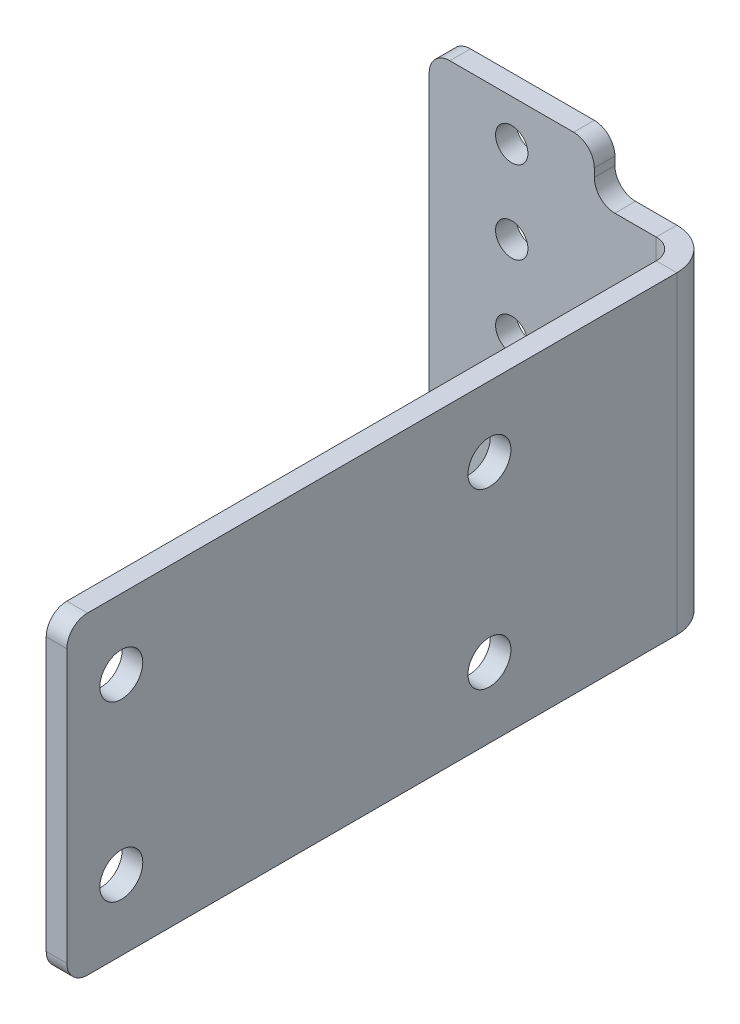
ISO-10303-21;
HEADER;
FILE_DESCRIPTION(('STEP AP214'),'2;1');
FILE_NAME('part.step','',(''),(''),'','','');
FILE_SCHEMA(('AUTOMOTIVE_DESIGN { 1 0 10303 214 1 1 1 1 }'));
ENDSEC;
DATA;
#1=APPLICATION_CONTEXT('core data for automotive mechanical design processes');
#2=APPLICATION_PROTOCOL_DEFINITION('international standard','automotive_design',2000,#1);
#3=PRODUCT_CONTEXT('',#1,'mechanical');
#4=PRODUCT('Part','Part','',(#3));
#5=PRODUCT_RELATED_PRODUCT_CATEGORY('part','',(#4));
#6=PRODUCT_DEFINITION_FORMATION('','',#4);
#7=PRODUCT_DEFINITION_CONTEXT('part definition',#1,'design');
#8=PRODUCT_DEFINITION('design','',#6,#7);
#9=PRODUCT_DEFINITION_SHAPE('','',#8);
#10=(LENGTH_UNIT() NAMED_UNIT(*) SI_UNIT(.MILLI.,.METRE.));
#11=(NAMED_UNIT(*) PLANE_ANGLE_UNIT() SI_UNIT($,.RADIAN.));
#12=(NAMED_UNIT(*) SI_UNIT($,.STERADIAN.) SOLID_ANGLE_UNIT());
#13=UNCERTAINTY_MEASURE_WITH_UNIT(LENGTH_MEASURE(1.E-05),#10,'distance_accuracy_value','');
#14=(GEOMETRIC_REPRESENTATION_CONTEXT(3) GLOBAL_UNCERTAINTY_ASSIGNED_CONTEXT((#13)) GLOBAL_UNIT_ASSIGNED_CONTEXT((#10,
#11,#12)) REPRESENTATION_CONTEXT('',''));
#15=CARTESIAN_POINT('',(0.,0.,0.));
#16=DIRECTION('',(0.,0.,1.));
#17=DIRECTION('',(1.,0.,0.));
#18=AXIS2_PLACEMENT_3D('',#15,#16,#17);
#19=CARTESIAN_POINT('',(-301.625,-138.43,170.7515));
#20=DIRECTION('',(0.,-1.,0.));
#21=DIRECTION('',(0.,0.,-1.));
#22=AXIS2_PLACEMENT_3D('',#19,#20,#21);
#23=PLANE('',#22);
#24=DIRECTION('',(1.,0.,0.));
#25=VECTOR('',#24,1.);
#26=CARTESIAN_POINT('',(-301.625,-138.43,217.678));
#27=LINE('',#26,#25);
#28=CARTESIAN_POINT('',(-304.8,-138.43,217.678));
#29=VERTEX_POINT('',#28);
#30=CARTESIAN_POINT('',(-301.625,-138.43,217.678));
#31=VERTEX_POINT('',#30);
#32=EDGE_CURVE('E11',#29,#31,#27,.T.);
#33=ORIENTED_EDGE('',*,*,#32,.F.);
#34=DIRECTION('',(0.,0.,1.));
#35=VECTOR('',#34,1.);
#36=CARTESIAN_POINT('',(-304.8,-138.43,170.75275));
#37=LINE('',#36,#35);
#38=CARTESIAN_POINT('',(-304.8,-138.43,127.));
#39=VERTEX_POINT('',#38);
#40=EDGE_CURVE('E212',#29,#39,#37,.F.);
#41=ORIENTED_EDGE('',*,*,#40,.T.);
#42=DIRECTION('',(1.,0.,0.));
#43=VECTOR('',#42,1.);
#44=CARTESIAN_POINT('',(-301.625,-138.43,127.));
#45=LINE('',#44,#43);
#46=CARTESIAN_POINT('',(-301.625,-138.43,127.));
#47=VERTEX_POINT('',#46);
#48=EDGE_CURVE('E28',#39,#47,#45,.T.);
#49=ORIENTED_EDGE('',*,*,#48,.T.);
#50=DIRECTION('',(0.,0.,-1.));
#51=VECTOR('',#50,1.);
#52=CARTESIAN_POINT('',(-301.625,-138.43,170.7515));
#53=LINE('',#52,#51);
#54=EDGE_CURVE('E164',#31,#47,#53,.T.);
#55=ORIENTED_EDGE('',*,*,#54,.F.);
#56=EDGE_LOOP('',(#33,#41,#49,#55));
#57=FACE_BOUND('',#56,.T.);
#58=ADVANCED_FACE('F17',(#57),#23,.T.);
#59=CARTESIAN_POINT('',(-301.625,-90.17,170.7515));
#60=DIRECTION('',(0.,-1.,0.));
#61=DIRECTION('',(0.,0.,-1.));
#62=AXIS2_PLACEMENT_3D('',#59,#60,#61);
#63=PLANE('',#62);
#64=DIRECTION('',(1.,0.,0.));
#65=VECTOR('',#64,1.);
#66=CARTESIAN_POINT('',(-301.625,-90.17,127.));
#67=LINE('',#66,#65);
#68=CARTESIAN_POINT('',(-304.8,-90.17,127.));
#69=VERTEX_POINT('',#68);
#70=CARTESIAN_POINT('',(-301.625,-90.17,127.));
#71=VERTEX_POINT('',#70);
#72=EDGE_CURVE('E144',#69,#71,#67,.T.);
#73=ORIENTED_EDGE('',*,*,#72,.F.);
#74=DIRECTION('',(0.,0.,1.));
#75=VECTOR('',#74,1.);
#76=CARTESIAN_POINT('',(-304.8,-90.17,170.75275));
#77=LINE('',#76,#75);
#78=CARTESIAN_POINT('',(-304.8,-90.17,217.678));
#79=VERTEX_POINT('',#78);
#80=EDGE_CURVE('E205',#79,#69,#77,.F.);
#81=ORIENTED_EDGE('',*,*,#80,.F.);
#82=DIRECTION('',(1.,0.,0.));
#83=VECTOR('',#82,1.);
#84=CARTESIAN_POINT('',(-301.625,-90.17,217.678));
#85=LINE('',#84,#83);
#86=CARTESIAN_POINT('',(-301.625,-90.17,217.678));
#87=VERTEX_POINT('',#86);
#88=EDGE_CURVE('E154',#79,#87,#85,.T.);
#89=ORIENTED_EDGE('',*,*,#88,.T.);
#90=DIRECTION('',(0.,0.,-1.));
#91=VECTOR('',#90,1.);
#92=CARTESIAN_POINT('',(-301.625,-90.17,170.7515));
#93=LINE('',#92,#91);
#94=EDGE_CURVE('E162',#87,#71,#93,.T.);
#95=ORIENTED_EDGE('',*,*,#94,.T.);
#96=EDGE_LOOP('',(#73,#81,#89,#95));
#97=FACE_BOUND('',#96,.T.);
#98=ADVANCED_FACE('F167',(#97),#63,.F.);
#99=CARTESIAN_POINT('',(-301.625,-93.345,217.678));
#100=DIRECTION('',(1.,0.,0.));
#101=DIRECTION('',(0.,0.,-1.));
#102=AXIS2_PLACEMENT_3D('',#99,#100,#101);
#103=CYLINDRICAL_SURFACE('',#102,3.175);
#104=ORIENTED_EDGE('',*,*,#88,.F.);
#105=CARTESIAN_POINT('',(-304.8,-93.345,217.678));
#106=DIRECTION('',(1.,0.,0.));
#107=DIRECTION('',(0.,0.,-1.));
#108=AXIS2_PLACEMENT_3D('',#105,#106,#107);
#109=CIRCLE('',#108,3.175);
#110=CARTESIAN_POINT('',(-304.8,-93.345,220.853));
#111=VERTEX_POINT('',#110);
#112=EDGE_CURVE('E202',#79,#111,#109,.T.);
#113=ORIENTED_EDGE('',*,*,#112,.T.);
#114=DIRECTION('',(1.,0.,0.));
#115=VECTOR('',#114,1.);
#116=CARTESIAN_POINT('',(-301.625,-93.345,220.853));
#117=LINE('',#116,#115);
#118=CARTESIAN_POINT('',(-301.625,-93.345,220.853));
#119=VERTEX_POINT('',#118);
#120=EDGE_CURVE('E36',#111,#119,#117,.T.);
#121=ORIENTED_EDGE('',*,*,#120,.T.);
#122=CARTESIAN_POINT('',(-301.625,-93.345,217.678));
#123=DIRECTION('',(1.,0.,0.));
#124=DIRECTION('',(0.,-1.,0.));
#125=AXIS2_PLACEMENT_3D('',#122,#123,#124);
#126=CIRCLE('',#125,3.175);
#127=EDGE_CURVE('E169',#87,#119,#126,.T.);
#128=ORIENTED_EDGE('',*,*,#127,.F.);
#129=EDGE_LOOP('',(#104,#113,#121,#128));
#130=FACE_BOUND('',#129,.T.);
#131=ADVANCED_FACE('F549',(#130),#103,.T.);
#132=CARTESIAN_POINT('',(-301.625,-114.3,220.853));
#133=DIRECTION('',(0.,0.,1.));
#134=DIRECTION('',(0.,-1.,0.));
#135=AXIS2_PLACEMENT_3D('',#132,#133,#134);
#136=PLANE('',#135);
#137=ORIENTED_EDGE('',*,*,#120,.F.);
#138=DIRECTION('',(0.,1.,0.));
#139=VECTOR('',#138,1.);
#140=CARTESIAN_POINT('',(-304.8,-114.3,220.853));
#141=LINE('',#140,#139);
#142=CARTESIAN_POINT('',(-304.8,-135.255,220.853));
#143=VERTEX_POINT('',#142);
#144=EDGE_CURVE('E197',#111,#143,#141,.F.);
#145=ORIENTED_EDGE('',*,*,#144,.T.);
#146=DIRECTION('',(1.,0.,0.));
#147=VECTOR('',#146,1.);
#148=CARTESIAN_POINT('',(-301.625,-135.255,220.853));
#149=LINE('',#148,#147);
#150=CARTESIAN_POINT('',(-301.625,-135.255,220.853));
#151=VERTEX_POINT('',#150);
#152=EDGE_CURVE('E21',#143,#151,#149,.T.);
#153=ORIENTED_EDGE('',*,*,#152,.T.);
#154=DIRECTION('',(0.,-1.,0.));
#155=VECTOR('',#154,1.);
#156=CARTESIAN_POINT('',(-301.625,-114.3,220.853));
#157=LINE('',#156,#155);
#158=EDGE_CURVE('E451',#119,#151,#157,.T.);
#159=ORIENTED_EDGE('',*,*,#158,.F.);
#160=EDGE_LOOP('',(#137,#145,#153,#159));
#161=FACE_BOUND('',#160,.T.);
#162=ADVANCED_FACE('F554',(#161),#136,.T.);
#163=CARTESIAN_POINT('',(-301.625,-100.965,155.829));
#164=DIRECTION('',(1.,0.,0.));
#165=DIRECTION('',(0.,0.,-1.));
#166=AXIS2_PLACEMENT_3D('',#163,#164,#165);
#167=CYLINDRICAL_SURFACE('',#166,3.302);
#168=CARTESIAN_POINT('',(-301.625,-100.965,155.829));
#169=DIRECTION('',(1.,0.,0.));
#170=DIRECTION('',(0.,0.,-1.));
#171=AXIS2_PLACEMENT_3D('',#168,#169,#170);
#172=CIRCLE('',#171,3.302);
#173=CARTESIAN_POINT('',(-301.625,-100.965,152.527));
#174=VERTEX_POINT('',#173);
#175=EDGE_CURVE('E204',#174,#174,#172,.T.);
#176=ORIENTED_EDGE('',*,*,#175,.T.);
#177=EDGE_LOOP('',(#176));
#178=FACE_BOUND('',#177,.T.);
#179=CARTESIAN_POINT('',(-304.8,-100.965,155.829));
#180=DIRECTION('',(1.,0.,0.));
#181=DIRECTION('',(0.,0.,-1.));
#182=AXIS2_PLACEMENT_3D('',#179,#180,#181);
#183=CIRCLE('',#182,3.302);
#184=CARTESIAN_POINT('',(-304.8,-100.965,152.527));
#185=VERTEX_POINT('',#184);
#186=EDGE_CURVE('E180',#185,#185,#183,.T.);
#187=ORIENTED_EDGE('',*,*,#186,.F.);
#188=EDGE_LOOP('',(#187));
#189=FACE_BOUND('',#188,.T.);
#190=ADVANCED_FACE('F557',(#178,#189),#167,.F.);
#191=CARTESIAN_POINT('',(-301.625,-127.635,212.471));
#192=DIRECTION('',(1.,0.,0.));
#193=DIRECTION('',(0.,0.,-1.));
#194=AXIS2_PLACEMENT_3D('',#191,#192,#193);
#195=CYLINDRICAL_SURFACE('',#194,3.302);
#196=CARTESIAN_POINT('',(-301.625,-127.635,212.471));
#197=DIRECTION('',(1.,0.,0.));
#198=DIRECTION('',(0.,0.,-1.));
#199=AXIS2_PLACEMENT_3D('',#196,#197,#198);
#200=CIRCLE('',#199,3.302);
#201=CARTESIAN_POINT('',(-301.625,-127.635,209.169));
#202=VERTEX_POINT('',#201);
#203=EDGE_CURVE('E439',#202,#202,#200,.T.);
#204=ORIENTED_EDGE('',*,*,#203,.T.);
#205=EDGE_LOOP('',(#204));
#206=FACE_BOUND('',#205,.T.);
#207=CARTESIAN_POINT('',(-304.8,-127.635,212.471));
#208=DIRECTION('',(1.,0.,0.));
#209=DIRECTION('',(0.,0.,-1.));
#210=AXIS2_PLACEMENT_3D('',#207,#208,#209);
#211=CIRCLE('',#210,3.302);
#212=CARTESIAN_POINT('',(-304.8,-127.635,209.169));
#213=VERTEX_POINT('',#212);
#214=EDGE_CURVE('E184',#213,#213,#211,.T.);
#215=ORIENTED_EDGE('',*,*,#214,.F.);
#216=EDGE_LOOP('',(#215));
#217=FACE_BOUND('',#216,.T.);
#218=ADVANCED_FACE('F566',(#206,#217),#195,.F.);
#219=CARTESIAN_POINT('',(-301.625,-127.635,155.829));
#220=DIRECTION('',(1.,0.,0.));
#221=DIRECTION('',(0.,0.,-1.));
#222=AXIS2_PLACEMENT_3D('',#219,#220,#221);
#223=CYLINDRICAL_SURFACE('',#222,3.302);
#224=CARTESIAN_POINT('',(-301.625,-127.635,155.829));
#225=DIRECTION('',(1.,0.,0.));
#226=DIRECTION('',(0.,0.,-1.));
#227=AXIS2_PLACEMENT_3D('',#224,#225,#226);
#228=CIRCLE('',#227,3.302);
#229=CARTESIAN_POINT('',(-301.625,-127.635,152.527));
#230=VERTEX_POINT('',#229);
#231=EDGE_CURVE('E443',#230,#230,#228,.T.);
#232=ORIENTED_EDGE('',*,*,#231,.T.);
#233=EDGE_LOOP('',(#232));
#234=FACE_BOUND('',#233,.T.);
#235=CARTESIAN_POINT('',(-304.8,-127.635,155.829));
#236=DIRECTION('',(1.,0.,0.));
#237=DIRECTION('',(0.,0.,-1.));
#238=AXIS2_PLACEMENT_3D('',#235,#236,#237);
#239=CIRCLE('',#238,3.302);
#240=CARTESIAN_POINT('',(-304.8,-127.635,152.527));
#241=VERTEX_POINT('',#240);
#242=EDGE_CURVE('E189',#241,#241,#239,.T.);
#243=ORIENTED_EDGE('',*,*,#242,.F.);
#244=EDGE_LOOP('',(#243));
#245=FACE_BOUND('',#244,.T.);
#246=ADVANCED_FACE('F562',(#234,#245),#223,.F.);
#247=CARTESIAN_POINT('',(-301.625,-100.965,212.471));
#248=DIRECTION('',(1.,0.,0.));
#249=DIRECTION('',(0.,0.,-1.));
#250=AXIS2_PLACEMENT_3D('',#247,#248,#249);
#251=CYLINDRICAL_SURFACE('',#250,3.302);
#252=CARTESIAN_POINT('',(-301.625,-100.965,212.471));
#253=DIRECTION('',(1.,0.,0.));
#254=DIRECTION('',(0.,0.,-1.));
#255=AXIS2_PLACEMENT_3D('',#252,#253,#254);
#256=CIRCLE('',#255,3.302);
#257=CARTESIAN_POINT('',(-301.625,-100.965,209.169));
#258=VERTEX_POINT('',#257);
#259=EDGE_CURVE('E447',#258,#258,#256,.T.);
#260=ORIENTED_EDGE('',*,*,#259,.T.);
#261=EDGE_LOOP('',(#260));
#262=FACE_BOUND('',#261,.T.);
#263=CARTESIAN_POINT('',(-304.8,-100.965,212.471));
#264=DIRECTION('',(1.,0.,0.));
#265=DIRECTION('',(0.,0.,-1.));
#266=AXIS2_PLACEMENT_3D('',#263,#264,#265);
#267=CIRCLE('',#266,3.302);
#268=CARTESIAN_POINT('',(-304.8,-100.965,209.169));
#269=VERTEX_POINT('',#268);
#270=EDGE_CURVE('E193',#269,#269,#267,.T.);
#271=ORIENTED_EDGE('',*,*,#270,.F.);
#272=EDGE_LOOP('',(#271));
#273=FACE_BOUND('',#272,.T.);
#274=ADVANCED_FACE('F559',(#262,#273),#251,.F.);
#275=CARTESIAN_POINT('',(-301.625,-135.255,217.678));
#276=DIRECTION('',(1.,0.,0.));
#277=DIRECTION('',(0.,0.,-1.));
#278=AXIS2_PLACEMENT_3D('',#275,#276,#277);
#279=CYLINDRICAL_SURFACE('',#278,3.175);
#280=CARTESIAN_POINT('',(-304.8,-135.255,217.678));
#281=DIRECTION('',(1.,0.,0.));
#282=DIRECTION('',(0.,0.,-1.));
#283=AXIS2_PLACEMENT_3D('',#280,#281,#282);
#284=CIRCLE('',#283,3.175);
#285=EDGE_CURVE('E201',#143,#29,#284,.T.);
#286=ORIENTED_EDGE('',*,*,#285,.T.);
#287=ORIENTED_EDGE('',*,*,#32,.T.);
#288=CARTESIAN_POINT('',(-301.625,-135.255,217.678));
#289=DIRECTION('',(1.,0.,0.));
#290=DIRECTION('',(0.,-1.,0.));
#291=AXIS2_PLACEMENT_3D('',#288,#289,#290);
#292=CIRCLE('',#291,3.175);
#293=EDGE_CURVE('E454',#151,#31,#292,.T.);
#294=ORIENTED_EDGE('',*,*,#293,.F.);
#295=ORIENTED_EDGE('',*,*,#152,.F.);
#296=EDGE_LOOP('',(#286,#287,#294,#295));
#297=FACE_BOUND('',#296,.T.);
#298=ADVANCED_FACE('F19',(#297),#279,.T.);
#299=CARTESIAN_POINT('',(-301.625,-114.3,170.75275));
#300=DIRECTION('',(1.,0.,0.));
#301=DIRECTION('',(0.,1.,0.));
#302=AXIS2_PLACEMENT_3D('',#299,#300,#301);
#303=PLANE('',#302);
#304=ORIENTED_EDGE('',*,*,#175,.F.);
#305=EDGE_LOOP('',(#304));
#306=FACE_BOUND('',#305,.T.);
#307=ORIENTED_EDGE('',*,*,#203,.F.);
#308=EDGE_LOOP('',(#307));
#309=FACE_BOUND('',#308,.T.);
#310=ORIENTED_EDGE('',*,*,#231,.F.);
#311=EDGE_LOOP('',(#310));
#312=FACE_BOUND('',#311,.T.);
#313=ORIENTED_EDGE('',*,*,#259,.F.);
#314=EDGE_LOOP('',(#313));
#315=FACE_BOUND('',#314,.T.);
#316=ORIENTED_EDGE('',*,*,#158,.T.);
#317=ORIENTED_EDGE('',*,*,#293,.T.);
#318=ORIENTED_EDGE('',*,*,#54,.T.);
#319=DIRECTION('',(0.,1.,0.));
#320=VECTOR('',#319,1.);
#321=CARTESIAN_POINT('',(-301.625,-114.3,127.));
#322=LINE('',#321,#320);
#323=EDGE_CURVE('E131',#47,#71,#322,.T.);
#324=ORIENTED_EDGE('',*,*,#323,.T.);
#325=ORIENTED_EDGE('',*,*,#94,.F.);
#326=ORIENTED_EDGE('',*,*,#127,.T.);
#327=EDGE_LOOP('',(#316,#317,#318,#324,#325,#326));
#328=FACE_BOUND('',#327,.T.);
#329=ADVANCED_FACE('F160',(#306,#309,#312,#315,#328),#303,.T.);
#330=CARTESIAN_POINT('',(-304.8,-114.3,170.75275));
#331=DIRECTION('',(1.,0.,0.));
#332=DIRECTION('',(0.,1.,0.));
#333=AXIS2_PLACEMENT_3D('',#330,#331,#332);
#334=PLANE('',#333);
#335=ORIENTED_EDGE('',*,*,#186,.T.);
#336=EDGE_LOOP('',(#335));
#337=FACE_BOUND('',#336,.T.);
#338=ORIENTED_EDGE('',*,*,#214,.T.);
#339=EDGE_LOOP('',(#338));
#340=FACE_BOUND('',#339,.T.);
#341=ORIENTED_EDGE('',*,*,#242,.T.);
#342=EDGE_LOOP('',(#341));
#343=FACE_BOUND('',#342,.T.);
#344=ORIENTED_EDGE('',*,*,#270,.T.);
#345=EDGE_LOOP('',(#344));
#346=FACE_BOUND('',#345,.T.);
#347=ORIENTED_EDGE('',*,*,#144,.F.);
#348=ORIENTED_EDGE('',*,*,#112,.F.);
#349=ORIENTED_EDGE('',*,*,#80,.T.);
#350=DIRECTION('',(0.,1.,0.));
#351=VECTOR('',#350,1.);
#352=CARTESIAN_POINT('',(-304.8,-114.3,127.));
#353=LINE('',#352,#351);
#354=EDGE_CURVE('E208',#39,#69,#353,.T.);
#355=ORIENTED_EDGE('',*,*,#354,.F.);
#356=ORIENTED_EDGE('',*,*,#40,.F.);
#357=ORIENTED_EDGE('',*,*,#285,.F.);
#358=EDGE_LOOP('',(#347,#348,#349,#355,#356,#357));
#359=FACE_BOUND('',#358,.T.);
#360=ADVANCED_FACE('F246',(#337,#340,#343,#346,#359),#334,.F.);
#361=CARTESIAN_POINT('',(-330.2,-146.05,120.65));
#362=DIRECTION('',(0.,1.,0.));
#363=DIRECTION('',(-1.,0.,0.));
#364=AXIS2_PLACEMENT_3D('',#361,#362,#363);
#365=PLANE('',#364);
#366=DIRECTION('',(0.,0.,-1.));
#367=VECTOR('',#366,1.);
#368=CARTESIAN_POINT('',(-320.675,-146.05,120.65));
#369=LINE('',#368,#367);
#370=CARTESIAN_POINT('',(-320.675,-146.05,123.825));
#371=VERTEX_POINT('',#370);
#372=CARTESIAN_POINT('',(-320.675,-146.05,120.65));
#373=VERTEX_POINT('',#372);
#374=EDGE_CURVE('E185',#371,#373,#369,.T.);
#375=ORIENTED_EDGE('',*,*,#374,.F.);
#376=DIRECTION('',(1.,0.,0.));
#377=VECTOR('',#376,1.);
#378=CARTESIAN_POINT('',(-322.26375,-146.05,123.825));
#379=LINE('',#378,#377);
#380=CARTESIAN_POINT('',(-339.725,-146.05,123.825));
#381=VERTEX_POINT('',#380);
#382=EDGE_CURVE('E390',#371,#381,#379,.F.);
#383=ORIENTED_EDGE('',*,*,#382,.T.);
#384=DIRECTION('',(0.,0.,-1.));
#385=VECTOR('',#384,1.);
#386=CARTESIAN_POINT('',(-339.725,-146.05,120.65));
#387=LINE('',#386,#385);
#388=CARTESIAN_POINT('',(-339.725,-146.05,120.65));
#389=VERTEX_POINT('',#388);
#390=EDGE_CURVE('E429',#381,#389,#387,.T.);
#391=ORIENTED_EDGE('',*,*,#390,.T.);
#392=DIRECTION('',(-1.,0.,0.));
#393=VECTOR('',#392,1.);
#394=CARTESIAN_POINT('',(-330.2,-146.05,120.65));
#395=LINE('',#394,#393);
#396=EDGE_CURVE('E490',#373,#389,#395,.T.);
#397=ORIENTED_EDGE('',*,*,#396,.F.);
#398=EDGE_LOOP('',(#375,#383,#391,#397));
#399=FACE_BOUND('',#398,.T.);
#400=ADVANCED_FACE('F576',(#399),#365,.F.);
#401=CARTESIAN_POINT('',(-339.725,-142.875,120.65));
#402=DIRECTION('',(0.,0.,1.));
#403=DIRECTION('',(1.,0.,0.));
#404=AXIS2_PLACEMENT_3D('',#401,#402,#403);
#405=CYLINDRICAL_SURFACE('',#404,3.175);
#406=ORIENTED_EDGE('',*,*,#390,.F.);
#407=CARTESIAN_POINT('',(-339.725,-142.875,123.825));
#408=DIRECTION('',(0.,0.,1.));
#409=DIRECTION('',(1.,0.,0.));
#410=AXIS2_PLACEMENT_3D('',#407,#408,#409);
#411=CIRCLE('',#410,3.175);
#412=CARTESIAN_POINT('',(-342.9,-142.875,123.825));
#413=VERTEX_POINT('',#412);
#414=EDGE_CURVE('E386',#381,#413,#411,.F.);
#415=ORIENTED_EDGE('',*,*,#414,.T.);
#416=DIRECTION('',(0.,0.,-1.));
#417=VECTOR('',#416,1.);
#418=CARTESIAN_POINT('',(-342.9,-142.875,120.65));
#419=LINE('',#418,#417);
#420=CARTESIAN_POINT('',(-342.9,-142.875,120.65));
#421=VERTEX_POINT('',#420);
#422=EDGE_CURVE('E426',#413,#421,#419,.T.);
#423=ORIENTED_EDGE('',*,*,#422,.T.);
#424=CARTESIAN_POINT('',(-339.725,-142.875,120.65));
#425=DIRECTION('',(0.,0.,1.));
#426=DIRECTION('',(1.,0.,0.));
#427=AXIS2_PLACEMENT_3D('',#424,#425,#426);
#428=CIRCLE('',#427,3.175);
#429=EDGE_CURVE('E493',#389,#421,#428,.F.);
#430=ORIENTED_EDGE('',*,*,#429,.F.);
#431=EDGE_LOOP('',(#406,#415,#423,#430));
#432=FACE_BOUND('',#431,.T.);
#433=ADVANCED_FACE('F588',(#432),#405,.T.);
#434=CARTESIAN_POINT('',(-342.9,0.,120.65));
#435=DIRECTION('',(-1.,0.,0.));
#436=DIRECTION('',(0.,-1.,0.));
#437=AXIS2_PLACEMENT_3D('',#434,#435,#436);
#438=PLANE('',#437);
#439=ORIENTED_EDGE('',*,*,#422,.F.);
#440=DIRECTION('',(0.,1.,0.));
#441=VECTOR('',#440,1.);
#442=CARTESIAN_POINT('',(-342.9,1.11022302462516E-13,123.825));
#443=LINE('',#442,#441);
#444=CARTESIAN_POINT('',(-342.9,-138.43,123.825));
#445=VERTEX_POINT('',#444);
#446=EDGE_CURVE('E382',#445,#413,#443,.F.);
#447=ORIENTED_EDGE('',*,*,#446,.F.);
#448=DIRECTION('',(0.,0.,-1.));
#449=VECTOR('',#448,1.);
#450=CARTESIAN_POINT('',(-342.9,-138.43,120.65));
#451=LINE('',#450,#449);
#452=CARTESIAN_POINT('',(-342.9,-138.43,120.65));
#453=VERTEX_POINT('',#452);
#454=EDGE_CURVE('E423',#445,#453,#451,.T.);
#455=ORIENTED_EDGE('',*,*,#454,.T.);
#456=DIRECTION('',(0.,-1.,0.));
#457=VECTOR('',#456,1.);
#458=CARTESIAN_POINT('',(-342.9,0.,120.65));
#459=LINE('',#458,#457);
#460=EDGE_CURVE('E499',#453,#421,#459,.T.);
#461=ORIENTED_EDGE('',*,*,#460,.T.);
#462=EDGE_LOOP('',(#439,#447,#455,#461));
#463=FACE_BOUND('',#462,.T.);
#464=ADVANCED_FACE('F592',(#463),#438,.T.);
#465=CARTESIAN_POINT('',(-342.9,0.,120.65));
#466=DIRECTION('',(-1.,0.,0.));
#467=DIRECTION('',(0.,-1.,0.));
#468=AXIS2_PLACEMENT_3D('',#465,#466,#467);
#469=PLANE('',#468);
#470=ORIENTED_EDGE('',*,*,#454,.F.);
#471=DIRECTION('',(0.,1.,0.));
#472=VECTOR('',#471,1.);
#473=CARTESIAN_POINT('',(-342.9,1.11022302462516E-13,123.825));
#474=LINE('',#473,#472);
#475=CARTESIAN_POINT('',(-342.9,-90.17,123.825));
#476=VERTEX_POINT('',#475);
#477=EDGE_CURVE('E378',#476,#445,#474,.F.);
#478=ORIENTED_EDGE('',*,*,#477,.F.);
#479=DIRECTION('',(0.,0.,-1.));
#480=VECTOR('',#479,1.);
#481=CARTESIAN_POINT('',(-342.9,-90.17,120.65));
#482=LINE('',#481,#480);
#483=CARTESIAN_POINT('',(-342.9,-90.17,120.65));
#484=VERTEX_POINT('',#483);
#485=EDGE_CURVE('E420',#476,#484,#482,.T.);
#486=ORIENTED_EDGE('',*,*,#485,.T.);
#487=EDGE_CURVE('E503',#484,#453,#459,.T.);
#488=ORIENTED_EDGE('',*,*,#487,.T.);
#489=EDGE_LOOP('',(#470,#478,#486,#488));
#490=FACE_BOUND('',#489,.T.);
#491=ADVANCED_FACE('F596',(#490),#469,.T.);
#492=CARTESIAN_POINT('',(-342.9,0.,120.65));
#493=DIRECTION('',(-1.,0.,0.));
#494=DIRECTION('',(0.,-1.,0.));
#495=AXIS2_PLACEMENT_3D('',#492,#493,#494);
#496=PLANE('',#495);
#497=ORIENTED_EDGE('',*,*,#485,.F.);
#498=DIRECTION('',(0.,1.,0.));
#499=VECTOR('',#498,1.);
#500=CARTESIAN_POINT('',(-342.9,1.11022302462516E-13,123.825));
#501=LINE('',#500,#499);
#502=CARTESIAN_POINT('',(-342.9,-85.725,123.825));
#503=VERTEX_POINT('',#502);
#504=EDGE_CURVE('E374',#503,#476,#501,.F.);
#505=ORIENTED_EDGE('',*,*,#504,.F.);
#506=DIRECTION('',(0.,0.,-1.));
#507=VECTOR('',#506,1.);
#508=CARTESIAN_POINT('',(-342.9,-85.725,120.65));
#509=LINE('',#508,#507);
#510=CARTESIAN_POINT('',(-342.9,-85.725,120.65));
#511=VERTEX_POINT('',#510);
#512=EDGE_CURVE('E417',#503,#511,#509,.T.);
#513=ORIENTED_EDGE('',*,*,#512,.T.);
#514=EDGE_CURVE('E509',#511,#484,#459,.T.);
#515=ORIENTED_EDGE('',*,*,#514,.T.);
#516=EDGE_LOOP('',(#497,#505,#513,#515));
#517=FACE_BOUND('',#516,.T.);
#518=ADVANCED_FACE('F600',(#517),#496,.T.);
#519=CARTESIAN_POINT('',(-339.725,-85.725,120.65));
#520=DIRECTION('',(0.,0.,1.));
#521=DIRECTION('',(1.,0.,0.));
#522=AXIS2_PLACEMENT_3D('',#519,#520,#521);
#523=CYLINDRICAL_SURFACE('',#522,3.175);
#524=ORIENTED_EDGE('',*,*,#512,.F.);
#525=CARTESIAN_POINT('',(-339.725,-85.725,123.825));
#526=DIRECTION('',(0.,0.,1.));
#527=DIRECTION('',(1.,0.,0.));
#528=AXIS2_PLACEMENT_3D('',#525,#526,#527);
#529=CIRCLE('',#528,3.175);
#530=CARTESIAN_POINT('',(-339.725,-82.55,123.825));
#531=VERTEX_POINT('',#530);
#532=EDGE_CURVE('E370',#503,#531,#529,.F.);
#533=ORIENTED_EDGE('',*,*,#532,.T.);
#534=DIRECTION('',(0.,0.,-1.));
#535=VECTOR('',#534,1.);
#536=CARTESIAN_POINT('',(-339.725,-82.55,120.65));
#537=LINE('',#536,#535);
#538=CARTESIAN_POINT('',(-339.725,-82.55,120.65));
#539=VERTEX_POINT('',#538);
#540=EDGE_CURVE('E414',#531,#539,#537,.T.);
#541=ORIENTED_EDGE('',*,*,#540,.T.);
#542=CARTESIAN_POINT('',(-339.725,-85.725,120.65));
#543=DIRECTION('',(0.,0.,1.));
#544=DIRECTION('',(1.,0.,0.));
#545=AXIS2_PLACEMENT_3D('',#542,#543,#544);
#546=CIRCLE('',#545,3.175);
#547=EDGE_CURVE('E513',#511,#539,#546,.F.);
#548=ORIENTED_EDGE('',*,*,#547,.F.);
#549=EDGE_LOOP('',(#524,#533,#541,#548));
#550=FACE_BOUND('',#549,.T.);
#551=ADVANCED_FACE('F604',(#550),#523,.T.);
#552=CARTESIAN_POINT('',(-330.2,-82.55,120.65));
#553=DIRECTION('',(0.,1.,0.));
#554=DIRECTION('',(-1.,0.,0.));
#555=AXIS2_PLACEMENT_3D('',#552,#553,#554);
#556=PLANE('',#555);
#557=ORIENTED_EDGE('',*,*,#540,.F.);
#558=DIRECTION('',(1.,0.,0.));
#559=VECTOR('',#558,1.);
#560=CARTESIAN_POINT('',(-322.26375,-82.55,123.825));
#561=LINE('',#560,#559);
#562=CARTESIAN_POINT('',(-320.675,-82.55,123.825));
#563=VERTEX_POINT('',#562);
#564=EDGE_CURVE('E366',#563,#531,#561,.F.);
#565=ORIENTED_EDGE('',*,*,#564,.F.);
#566=DIRECTION('',(0.,0.,-1.));
#567=VECTOR('',#566,1.);
#568=CARTESIAN_POINT('',(-320.675,-82.55,120.65));
#569=LINE('',#568,#567);
#570=CARTESIAN_POINT('',(-320.675,-82.55,120.65));
#571=VERTEX_POINT('',#570);
#572=EDGE_CURVE('E411',#563,#571,#569,.T.);
#573=ORIENTED_EDGE('',*,*,#572,.T.);
#574=DIRECTION('',(-1.,0.,0.));
#575=VECTOR('',#574,1.);
#576=CARTESIAN_POINT('',(-330.2,-82.55,120.65));
#577=LINE('',#576,#575);
#578=EDGE_CURVE('E481',#571,#539,#577,.T.);
#579=ORIENTED_EDGE('',*,*,#578,.T.);
#580=EDGE_LOOP('',(#557,#565,#573,#579));
#581=FACE_BOUND('',#580,.T.);
#582=ADVANCED_FACE('F608',(#581),#556,.T.);
#583=CARTESIAN_POINT('',(-320.675,-85.725,120.65));
#584=DIRECTION('',(0.,0.,1.));
#585=DIRECTION('',(1.,0.,0.));
#586=AXIS2_PLACEMENT_3D('',#583,#584,#585);
#587=CYLINDRICAL_SURFACE('',#586,3.175);
#588=ORIENTED_EDGE('',*,*,#572,.F.);
#589=CARTESIAN_POINT('',(-320.675,-85.725,123.825));
#590=DIRECTION('',(0.,0.,1.));
#591=DIRECTION('',(1.,0.,0.));
#592=AXIS2_PLACEMENT_3D('',#589,#590,#591);
#593=CIRCLE('',#592,3.175);
#594=CARTESIAN_POINT('',(-317.5,-85.725,123.825));
#595=VERTEX_POINT('',#594);
#596=EDGE_CURVE('E362',#563,#595,#593,.F.);
#597=ORIENTED_EDGE('',*,*,#596,.T.);
#598=DIRECTION('',(0.,0.,-1.));
#599=VECTOR('',#598,1.);
#600=CARTESIAN_POINT('',(-317.5,-85.725,120.65));
#601=LINE('',#600,#599);
#602=CARTESIAN_POINT('',(-317.5,-85.725,120.65));
#603=VERTEX_POINT('',#602);
#604=EDGE_CURVE('E408',#595,#603,#601,.T.);
#605=ORIENTED_EDGE('',*,*,#604,.T.);
#606=CARTESIAN_POINT('',(-320.675,-85.725,120.65));
#607=DIRECTION('',(0.,0.,1.));
#608=DIRECTION('',(1.,0.,0.));
#609=AXIS2_PLACEMENT_3D('',#606,#607,#608);
#610=CIRCLE('',#609,3.175);
#611=EDGE_CURVE('E473',#571,#603,#610,.F.);
#612=ORIENTED_EDGE('',*,*,#611,.F.);
#613=EDGE_LOOP('',(#588,#597,#605,#612));
#614=FACE_BOUND('',#613,.T.);
#615=ADVANCED_FACE('F612',(#614),#587,.T.);
#616=CARTESIAN_POINT('',(-317.5,0.,120.65));
#617=DIRECTION('',(-1.,0.,0.));
#618=DIRECTION('',(0.,-1.,0.));
#619=AXIS2_PLACEMENT_3D('',#616,#617,#618);
#620=PLANE('',#619);
#621=ORIENTED_EDGE('',*,*,#604,.F.);
#622=DIRECTION('',(0.,1.,0.));
#623=VECTOR('',#622,1.);
#624=CARTESIAN_POINT('',(-317.5,1.11022302462516E-13,123.825));
#625=LINE('',#624,#623);
#626=CARTESIAN_POINT('',(-317.5,-86.995,123.825));
#627=VERTEX_POINT('',#626);
#628=EDGE_CURVE('E358',#595,#627,#625,.F.);
#629=ORIENTED_EDGE('',*,*,#628,.T.);
#630=DIRECTION('',(0.,0.,-1.));
#631=VECTOR('',#630,1.);
#632=CARTESIAN_POINT('',(-317.5,-86.995,120.65));
#633=LINE('',#632,#631);
#634=CARTESIAN_POINT('',(-317.5,-86.995,120.65));
#635=VERTEX_POINT('',#634);
#636=EDGE_CURVE('E405',#627,#635,#633,.T.);
#637=ORIENTED_EDGE('',*,*,#636,.T.);
#638=DIRECTION('',(0.,-1.,0.));
#639=VECTOR('',#638,1.);
#640=CARTESIAN_POINT('',(-317.5,0.,120.65));
#641=LINE('',#640,#639);
#642=EDGE_CURVE('E470',#603,#635,#641,.T.);
#643=ORIENTED_EDGE('',*,*,#642,.F.);
#644=EDGE_LOOP('',(#621,#629,#637,#643));
#645=FACE_BOUND('',#644,.T.);
#646=ADVANCED_FACE('F544',(#645),#620,.F.);
#647=CARTESIAN_POINT('',(-314.325,-86.995,120.65));
#648=DIRECTION('',(0.,0.,1.));
#649=DIRECTION('',(1.,0.,0.));
#650=AXIS2_PLACEMENT_3D('',#647,#648,#649);
#651=CYLINDRICAL_SURFACE('',#650,3.175);
#652=ORIENTED_EDGE('',*,*,#636,.F.);
#653=CARTESIAN_POINT('',(-314.325,-86.995,123.825));
#654=DIRECTION('',(0.,0.,1.));
#655=DIRECTION('',(1.,0.,0.));
#656=AXIS2_PLACEMENT_3D('',#653,#654,#655);
#657=CIRCLE('',#656,3.175);
#658=CARTESIAN_POINT('',(-314.325,-90.17,123.825));
#659=VERTEX_POINT('',#658);
#660=EDGE_CURVE('E354',#627,#659,#657,.T.);
#661=ORIENTED_EDGE('',*,*,#660,.T.);
#662=DIRECTION('',(0.,0.,-1.));
#663=VECTOR('',#662,1.);
#664=CARTESIAN_POINT('',(-314.325,-90.17,120.65));
#665=LINE('',#664,#663);
#666=CARTESIAN_POINT('',(-314.325,-90.17,120.65));
#667=VERTEX_POINT('',#666);
#668=EDGE_CURVE('E402',#659,#667,#665,.T.);
#669=ORIENTED_EDGE('',*,*,#668,.T.);
#670=CARTESIAN_POINT('',(-314.325,-86.995,120.65));
#671=DIRECTION('',(0.,0.,1.));
#672=DIRECTION('',(1.,0.,0.));
#673=AXIS2_PLACEMENT_3D('',#670,#671,#672);
#674=CIRCLE('',#673,3.175);
#675=EDGE_CURVE('E472',#635,#667,#674,.T.);
#676=ORIENTED_EDGE('',*,*,#675,.F.);
#677=EDGE_LOOP('',(#652,#661,#669,#676));
#678=FACE_BOUND('',#677,.T.);
#679=ADVANCED_FACE('F617',(#678),#651,.F.);
#680=CARTESIAN_POINT('',(-309.5625,-90.17,120.65));
#681=DIRECTION('',(0.,1.,0.));
#682=DIRECTION('',(-1.,0.,0.));
#683=AXIS2_PLACEMENT_3D('',#680,#681,#682);
#684=PLANE('',#683);
#685=ORIENTED_EDGE('',*,*,#668,.F.);
#686=DIRECTION('',(1.,0.,0.));
#687=VECTOR('',#686,1.);
#688=CARTESIAN_POINT('',(-322.26375,-90.17,123.825));
#689=LINE('',#688,#687);
#690=CARTESIAN_POINT('',(-307.975,-90.17,123.825));
#691=VERTEX_POINT('',#690);
#692=EDGE_CURVE('E350',#691,#659,#689,.F.);
#693=ORIENTED_EDGE('',*,*,#692,.F.);
#694=DIRECTION('',(0.,0.,-1.));
#695=VECTOR('',#694,1.);
#696=CARTESIAN_POINT('',(-307.975,-90.17,120.65));
#697=LINE('',#696,#695);
#698=CARTESIAN_POINT('',(-307.975,-90.17,120.65));
#699=VERTEX_POINT('',#698);
#700=EDGE_CURVE('E294',#691,#699,#697,.T.);
#701=ORIENTED_EDGE('',*,*,#700,.T.);
#702=DIRECTION('',(-1.,0.,0.));
#703=VECTOR('',#702,1.);
#704=CARTESIAN_POINT('',(-309.5625,-90.17,120.65));
#705=LINE('',#704,#703);
#706=EDGE_CURVE('E306',#699,#667,#705,.T.);
#707=ORIENTED_EDGE('',*,*,#706,.T.);
#708=EDGE_LOOP('',(#685,#693,#701,#707));
#709=FACE_BOUND('',#708,.T.);
#710=ADVANCED_FACE('F521',(#709),#684,.T.);
#711=CARTESIAN_POINT('',(-309.5625,-138.43,120.65));
#712=DIRECTION('',(0.,-1.,0.));
#713=DIRECTION('',(1.,0.,0.));
#714=AXIS2_PLACEMENT_3D('',#711,#712,#713);
#715=PLANE('',#714);
#716=DIRECTION('',(0.,0.,-1.));
#717=VECTOR('',#716,1.);
#718=CARTESIAN_POINT('',(-307.975,-138.43,120.65));
#719=LINE('',#718,#717);
#720=CARTESIAN_POINT('',(-307.975,-138.43,123.825));
#721=VERTEX_POINT('',#720);
#722=CARTESIAN_POINT('',(-307.975,-138.43,120.65));
#723=VERTEX_POINT('',#722);
#724=EDGE_CURVE('E288',#721,#723,#719,.T.);
#725=ORIENTED_EDGE('',*,*,#724,.F.);
#726=DIRECTION('',(1.,0.,0.));
#727=VECTOR('',#726,1.);
#728=CARTESIAN_POINT('',(-322.26375,-138.43,123.825));
#729=LINE('',#728,#727);
#730=CARTESIAN_POINT('',(-314.325,-138.43,123.825));
#731=VERTEX_POINT('',#730);
#732=EDGE_CURVE('E345',#731,#721,#729,.T.);
#733=ORIENTED_EDGE('',*,*,#732,.F.);
#734=DIRECTION('',(0.,0.,-1.));
#735=VECTOR('',#734,1.);
#736=CARTESIAN_POINT('',(-314.325,-138.43,120.65));
#737=LINE('',#736,#735);
#738=CARTESIAN_POINT('',(-314.325,-138.43,120.65));
#739=VERTEX_POINT('',#738);
#740=EDGE_CURVE('E295',#731,#739,#737,.T.);
#741=ORIENTED_EDGE('',*,*,#740,.T.);
#742=DIRECTION('',(1.,0.,0.));
#743=VECTOR('',#742,1.);
#744=CARTESIAN_POINT('',(-309.5625,-138.43,120.65));
#745=LINE('',#744,#743);
#746=EDGE_CURVE('E303',#739,#723,#745,.T.);
#747=ORIENTED_EDGE('',*,*,#746,.T.);
#748=EDGE_LOOP('',(#725,#733,#741,#747));
#749=FACE_BOUND('',#748,.T.);
#750=ADVANCED_FACE('F308',(#749),#715,.T.);
#751=CARTESIAN_POINT('',(-314.325,-141.605,120.65));
#752=DIRECTION('',(0.,0.,1.));
#753=DIRECTION('',(1.,0.,0.));
#754=AXIS2_PLACEMENT_3D('',#751,#752,#753);
#755=CYLINDRICAL_SURFACE('',#754,3.175);
#756=ORIENTED_EDGE('',*,*,#740,.F.);
#757=CARTESIAN_POINT('',(-314.325,-141.605,123.825));
#758=DIRECTION('',(0.,0.,1.));
#759=DIRECTION('',(1.,0.,0.));
#760=AXIS2_PLACEMENT_3D('',#757,#758,#759);
#761=CIRCLE('',#760,3.175);
#762=CARTESIAN_POINT('',(-317.5,-141.605,123.825));
#763=VERTEX_POINT('',#762);
#764=EDGE_CURVE('E341',#731,#763,#761,.T.);
#765=ORIENTED_EDGE('',*,*,#764,.T.);
#766=DIRECTION('',(0.,0.,-1.));
#767=VECTOR('',#766,1.);
#768=CARTESIAN_POINT('',(-317.5,-141.605,120.65));
#769=LINE('',#768,#767);
#770=CARTESIAN_POINT('',(-317.5,-141.605,120.65));
#771=VERTEX_POINT('',#770);
#772=EDGE_CURVE('E68',#763,#771,#769,.T.);
#773=ORIENTED_EDGE('',*,*,#772,.T.);
#774=CARTESIAN_POINT('',(-314.325,-141.605,120.65));
#775=DIRECTION('',(0.,0.,1.));
#776=DIRECTION('',(1.,0.,0.));
#777=AXIS2_PLACEMENT_3D('',#774,#775,#776);
#778=CIRCLE('',#777,3.175);
#779=EDGE_CURVE('E310',#739,#771,#778,.T.);
#780=ORIENTED_EDGE('',*,*,#779,.F.);
#781=EDGE_LOOP('',(#756,#765,#773,#780));
#782=FACE_BOUND('',#781,.T.);
#783=ADVANCED_FACE('F533',(#782),#755,.F.);
#784=ORIENTED_EDGE('',*,*,#772,.F.);
#785=DIRECTION('',(0.,1.,0.));
#786=VECTOR('',#785,1.);
#787=CARTESIAN_POINT('',(-317.5,1.11022302462516E-13,123.825));
#788=LINE('',#787,#786);
#789=CARTESIAN_POINT('',(-317.5,-142.875,123.825));
#790=VERTEX_POINT('',#789);
#791=EDGE_CURVE('E336',#763,#790,#788,.F.);
#792=ORIENTED_EDGE('',*,*,#791,.T.);
#793=DIRECTION('',(0.,0.,-1.));
#794=VECTOR('',#793,1.);
#795=CARTESIAN_POINT('',(-317.5,-142.875,120.65));
#796=LINE('',#795,#794);
#797=CARTESIAN_POINT('',(-317.5,-142.875,120.65));
#798=VERTEX_POINT('',#797);
#799=EDGE_CURVE('E314',#790,#798,#796,.T.);
#800=ORIENTED_EDGE('',*,*,#799,.T.);
#801=EDGE_CURVE('E466',#771,#798,#641,.T.);
#802=ORIENTED_EDGE('',*,*,#801,.F.);
#803=EDGE_LOOP('',(#784,#792,#800,#802));
#804=FACE_BOUND('',#803,.T.);
#805=ADVANCED_FACE('F535',(#804),#620,.F.);
#806=CARTESIAN_POINT('',(-330.2,-88.9,120.65));
#807=DIRECTION('',(0.,0.,1.));
#808=DIRECTION('',(1.,0.,0.));
#809=AXIS2_PLACEMENT_3D('',#806,#807,#808);
#810=CYLINDRICAL_SURFACE('',#809,2.48920000000003);
#811=CARTESIAN_POINT('',(-330.2,-88.9,120.65));
#812=DIRECTION('',(0.,0.,1.));
#813=DIRECTION('',(1.,0.,0.));
#814=AXIS2_PLACEMENT_3D('',#811,#812,#813);
#815=CIRCLE('',#814,2.48920000000003);
#816=CARTESIAN_POINT('',(-327.7108,-88.9,120.65));
#817=VERTEX_POINT('',#816);
#818=EDGE_CURVE('E344',#817,#817,#815,.T.);
#819=ORIENTED_EDGE('',*,*,#818,.F.);
#820=EDGE_LOOP('',(#819));
#821=FACE_BOUND('',#820,.T.);
#822=CARTESIAN_POINT('',(-330.2,-88.9,123.825));
#823=DIRECTION('',(0.,0.,1.));
#824=DIRECTION('',(1.,0.,0.));
#825=AXIS2_PLACEMENT_3D('',#822,#823,#824);
#826=CIRCLE('',#825,2.48920000000003);
#827=CARTESIAN_POINT('',(-327.7108,-88.9,123.825));
#828=VERTEX_POINT('',#827);
#829=EDGE_CURVE('E286',#828,#828,#826,.T.);
#830=ORIENTED_EDGE('',*,*,#829,.T.);
#831=EDGE_LOOP('',(#830));
#832=FACE_BOUND('',#831,.T.);
#833=ADVANCED_FACE('F541',(#821,#832),#810,.F.);
#834=CARTESIAN_POINT('',(-330.2,-101.6,120.65));
#835=DIRECTION('',(0.,0.,1.));
#836=DIRECTION('',(1.,0.,0.));
#837=AXIS2_PLACEMENT_3D('',#834,#835,#836);
#838=CYLINDRICAL_SURFACE('',#837,2.48920000000003);
#839=CARTESIAN_POINT('',(-330.2,-101.6,120.65));
#840=DIRECTION('',(0.,0.,1.));
#841=DIRECTION('',(1.,0.,0.));
#842=AXIS2_PLACEMENT_3D('',#839,#840,#841);
#843=CIRCLE('',#842,2.48920000000003);
#844=CARTESIAN_POINT('',(-327.7108,-101.6,120.65));
#845=VERTEX_POINT('',#844);
#846=EDGE_CURVE('E761',#845,#845,#843,.T.);
#847=ORIENTED_EDGE('',*,*,#846,.F.);
#848=EDGE_LOOP('',(#847));
#849=FACE_BOUND('',#848,.T.);
#850=CARTESIAN_POINT('',(-330.2,-101.6,123.825));
#851=DIRECTION('',(0.,0.,1.));
#852=DIRECTION('',(1.,0.,0.));
#853=AXIS2_PLACEMENT_3D('',#850,#851,#852);
#854=CIRCLE('',#853,2.48920000000003);
#855=CARTESIAN_POINT('',(-327.7108,-101.6,123.825));
#856=VERTEX_POINT('',#855);
#857=EDGE_CURVE('E321',#856,#856,#854,.T.);
#858=ORIENTED_EDGE('',*,*,#857,.T.);
#859=EDGE_LOOP('',(#858));
#860=FACE_BOUND('',#859,.T.);
#861=ADVANCED_FACE('F652',(#849,#860),#838,.F.);
#862=CARTESIAN_POINT('',(-330.2,-114.3,120.65));
#863=DIRECTION('',(0.,0.,1.));
#864=DIRECTION('',(1.,0.,0.));
#865=AXIS2_PLACEMENT_3D('',#862,#863,#864);
#866=CYLINDRICAL_SURFACE('',#865,2.48920000000003);
#867=CARTESIAN_POINT('',(-330.2,-114.3,120.65));
#868=DIRECTION('',(0.,0.,1.));
#869=DIRECTION('',(1.,0.,0.));
#870=AXIS2_PLACEMENT_3D('',#867,#868,#869);
#871=CIRCLE('',#870,2.48920000000003);
#872=CARTESIAN_POINT('',(-327.7108,-114.3,120.65));
#873=VERTEX_POINT('',#872);
#874=EDGE_CURVE('E765',#873,#873,#871,.T.);
#875=ORIENTED_EDGE('',*,*,#874,.F.);
#876=EDGE_LOOP('',(#875));
#877=FACE_BOUND('',#876,.T.);
#878=CARTESIAN_POINT('',(-330.2,-114.3,123.825));
#879=DIRECTION('',(0.,0.,1.));
#880=DIRECTION('',(1.,0.,0.));
#881=AXIS2_PLACEMENT_3D('',#878,#879,#880);
#882=CIRCLE('',#881,2.48920000000003);
#883=CARTESIAN_POINT('',(-327.7108,-114.3,123.825));
#884=VERTEX_POINT('',#883);
#885=EDGE_CURVE('E325',#884,#884,#882,.T.);
#886=ORIENTED_EDGE('',*,*,#885,.T.);
#887=EDGE_LOOP('',(#886));
#888=FACE_BOUND('',#887,.T.);
#889=ADVANCED_FACE('F661',(#877,#888),#866,.F.);
#890=CARTESIAN_POINT('',(-330.2,-127.,120.65));
#891=DIRECTION('',(0.,0.,1.));
#892=DIRECTION('',(1.,0.,0.));
#893=AXIS2_PLACEMENT_3D('',#890,#891,#892);
#894=CYLINDRICAL_SURFACE('',#893,2.48920000000003);
#895=CARTESIAN_POINT('',(-330.2,-127.,120.65));
#896=DIRECTION('',(0.,0.,1.));
#897=DIRECTION('',(1.,0.,0.));
#898=AXIS2_PLACEMENT_3D('',#895,#896,#897);
#899=CIRCLE('',#898,2.48920000000003);
#900=CARTESIAN_POINT('',(-327.7108,-127.,120.65));
#901=VERTEX_POINT('',#900);
#902=EDGE_CURVE('E467',#901,#901,#899,.T.);
#903=ORIENTED_EDGE('',*,*,#902,.F.);
#904=EDGE_LOOP('',(#903));
#905=FACE_BOUND('',#904,.T.);
#906=CARTESIAN_POINT('',(-330.2,-127.,123.825));
#907=DIRECTION('',(0.,0.,1.));
#908=DIRECTION('',(1.,0.,0.));
#909=AXIS2_PLACEMENT_3D('',#906,#907,#908);
#910=CIRCLE('',#909,2.48920000000003);
#911=CARTESIAN_POINT('',(-327.7108,-127.,123.825));
#912=VERTEX_POINT('',#911);
#913=EDGE_CURVE('E329',#912,#912,#910,.T.);
#914=ORIENTED_EDGE('',*,*,#913,.T.);
#915=EDGE_LOOP('',(#914));
#916=FACE_BOUND('',#915,.T.);
#917=ADVANCED_FACE('F670',(#905,#916),#894,.F.);
#918=CARTESIAN_POINT('',(-330.2,-139.7,120.65));
#919=DIRECTION('',(0.,0.,1.));
#920=DIRECTION('',(1.,0.,0.));
#921=AXIS2_PLACEMENT_3D('',#918,#919,#920);
#922=CYLINDRICAL_SURFACE('',#921,2.48920000000003);
#923=CARTESIAN_POINT('',(-330.2,-139.7,120.65));
#924=DIRECTION('',(0.,0.,1.));
#925=DIRECTION('',(1.,0.,0.));
#926=AXIS2_PLACEMENT_3D('',#923,#924,#925);
#927=CIRCLE('',#926,2.48920000000003);
#928=CARTESIAN_POINT('',(-327.7108,-139.7,120.65));
#929=VERTEX_POINT('',#928);
#930=EDGE_CURVE('E464',#929,#929,#927,.T.);
#931=ORIENTED_EDGE('',*,*,#930,.F.);
#932=EDGE_LOOP('',(#931));
#933=FACE_BOUND('',#932,.T.);
#934=CARTESIAN_POINT('',(-330.2,-139.7,123.825));
#935=DIRECTION('',(0.,0.,1.));
#936=DIRECTION('',(1.,0.,0.));
#937=AXIS2_PLACEMENT_3D('',#934,#935,#936);
#938=CIRCLE('',#937,2.48920000000003);
#939=CARTESIAN_POINT('',(-327.7108,-139.7,123.825));
#940=VERTEX_POINT('',#939);
#941=EDGE_CURVE('E333',#940,#940,#938,.T.);
#942=ORIENTED_EDGE('',*,*,#941,.T.);
#943=EDGE_LOOP('',(#942));
#944=FACE_BOUND('',#943,.T.);
#945=ADVANCED_FACE('F584',(#933,#944),#922,.F.);
#946=CARTESIAN_POINT('',(-320.675,-142.875,120.65));
#947=DIRECTION('',(0.,0.,1.));
#948=DIRECTION('',(1.,0.,0.));
#949=AXIS2_PLACEMENT_3D('',#946,#947,#948);
#950=CYLINDRICAL_SURFACE('',#949,3.175);
#951=CARTESIAN_POINT('',(-320.675,-142.875,123.825));
#952=DIRECTION('',(0.,0.,1.));
#953=DIRECTION('',(1.,0.,0.));
#954=AXIS2_PLACEMENT_3D('',#951,#952,#953);
#955=CIRCLE('',#954,3.175);
#956=EDGE_CURVE('E340',#790,#371,#955,.F.);
#957=ORIENTED_EDGE('',*,*,#956,.T.);
#958=ORIENTED_EDGE('',*,*,#374,.T.);
#959=CARTESIAN_POINT('',(-320.675,-142.875,120.65));
#960=DIRECTION('',(0.,0.,1.));
#961=DIRECTION('',(1.,0.,0.));
#962=AXIS2_PLACEMENT_3D('',#959,#960,#961);
#963=CIRCLE('',#962,3.175);
#964=EDGE_CURVE('E485',#798,#373,#963,.F.);
#965=ORIENTED_EDGE('',*,*,#964,.F.);
#966=ORIENTED_EDGE('',*,*,#799,.F.);
#967=EDGE_LOOP('',(#957,#958,#965,#966));
#968=FACE_BOUND('',#967,.T.);
#969=ADVANCED_FACE('F581',(#968),#950,.T.);
#970=CARTESIAN_POINT('',(-322.26375,1.11022302462516E-13,120.65));
#971=DIRECTION('',(0.,0.,1.));
#972=DIRECTION('',(1.,0.,0.));
#973=AXIS2_PLACEMENT_3D('',#970,#971,#972);
#974=PLANE('',#973);
#975=ORIENTED_EDGE('',*,*,#818,.T.);
#976=EDGE_LOOP('',(#975));
#977=FACE_BOUND('',#976,.T.);
#978=ORIENTED_EDGE('',*,*,#846,.T.);
#979=EDGE_LOOP('',(#978));
#980=FACE_BOUND('',#979,.T.);
#981=ORIENTED_EDGE('',*,*,#874,.T.);
#982=EDGE_LOOP('',(#981));
#983=FACE_BOUND('',#982,.T.);
#984=ORIENTED_EDGE('',*,*,#902,.T.);
#985=EDGE_LOOP('',(#984));
#986=FACE_BOUND('',#985,.T.);
#987=ORIENTED_EDGE('',*,*,#930,.T.);
#988=EDGE_LOOP('',(#987));
#989=FACE_BOUND('',#988,.T.);
#990=ORIENTED_EDGE('',*,*,#801,.T.);
#991=ORIENTED_EDGE('',*,*,#964,.T.);
#992=ORIENTED_EDGE('',*,*,#396,.T.);
#993=ORIENTED_EDGE('',*,*,#429,.T.);
#994=ORIENTED_EDGE('',*,*,#460,.F.);
#995=ORIENTED_EDGE('',*,*,#487,.F.);
#996=ORIENTED_EDGE('',*,*,#514,.F.);
#997=ORIENTED_EDGE('',*,*,#547,.T.);
#998=ORIENTED_EDGE('',*,*,#578,.F.);
#999=ORIENTED_EDGE('',*,*,#611,.T.);
#1000=ORIENTED_EDGE('',*,*,#642,.T.);
#1001=ORIENTED_EDGE('',*,*,#675,.T.);
#1002=ORIENTED_EDGE('',*,*,#706,.F.);
#1003=DIRECTION('',(0.,1.,0.));
#1004=VECTOR('',#1003,1.);
#1005=CARTESIAN_POINT('',(-307.975,-114.3,120.65));
#1006=LINE('',#1005,#1004);
#1007=EDGE_CURVE('E134',#699,#723,#1006,.F.);
#1008=ORIENTED_EDGE('',*,*,#1007,.T.);
#1009=ORIENTED_EDGE('',*,*,#746,.F.);
#1010=ORIENTED_EDGE('',*,*,#779,.T.);
#1011=EDGE_LOOP('',(#990,#991,#992,#993,#994,#995,#996,#997,#998,#999,#1000,#1001,#1002,#1008,
#1009,#1010));
#1012=FACE_BOUND('',#1011,.T.);
#1013=ADVANCED_FACE('F301',(#977,#980,#983,#986,#989,#1012),#974,.F.);
#1014=CARTESIAN_POINT('',(-322.26375,1.11022302462516E-13,123.825));
#1015=DIRECTION('',(0.,0.,1.));
#1016=DIRECTION('',(1.,0.,0.));
#1017=AXIS2_PLACEMENT_3D('',#1014,#1015,#1016);
#1018=PLANE('',#1017);
#1019=ORIENTED_EDGE('',*,*,#829,.F.);
#1020=EDGE_LOOP('',(#1019));
#1021=FACE_BOUND('',#1020,.T.);
#1022=ORIENTED_EDGE('',*,*,#857,.F.);
#1023=EDGE_LOOP('',(#1022));
#1024=FACE_BOUND('',#1023,.T.);
#1025=ORIENTED_EDGE('',*,*,#885,.F.);
#1026=EDGE_LOOP('',(#1025));
#1027=FACE_BOUND('',#1026,.T.);
#1028=ORIENTED_EDGE('',*,*,#913,.F.);
#1029=EDGE_LOOP('',(#1028));
#1030=FACE_BOUND('',#1029,.T.);
#1031=ORIENTED_EDGE('',*,*,#941,.F.);
#1032=EDGE_LOOP('',(#1031));
#1033=FACE_BOUND('',#1032,.T.);
#1034=ORIENTED_EDGE('',*,*,#791,.F.);
#1035=ORIENTED_EDGE('',*,*,#764,.F.);
#1036=ORIENTED_EDGE('',*,*,#732,.T.);
#1037=DIRECTION('',(0.,1.,0.));
#1038=VECTOR('',#1037,1.);
#1039=CARTESIAN_POINT('',(-307.975,1.11022302462516E-13,123.825));
#1040=LINE('',#1039,#1038);
#1041=EDGE_CURVE('E240',#691,#721,#1040,.F.);
#1042=ORIENTED_EDGE('',*,*,#1041,.F.);
#1043=ORIENTED_EDGE('',*,*,#692,.T.);
#1044=ORIENTED_EDGE('',*,*,#660,.F.);
#1045=ORIENTED_EDGE('',*,*,#628,.F.);
#1046=ORIENTED_EDGE('',*,*,#596,.F.);
#1047=ORIENTED_EDGE('',*,*,#564,.T.);
#1048=ORIENTED_EDGE('',*,*,#532,.F.);
#1049=ORIENTED_EDGE('',*,*,#504,.T.);
#1050=ORIENTED_EDGE('',*,*,#477,.T.);
#1051=ORIENTED_EDGE('',*,*,#446,.T.);
#1052=ORIENTED_EDGE('',*,*,#414,.F.);
#1053=ORIENTED_EDGE('',*,*,#382,.F.);
#1054=ORIENTED_EDGE('',*,*,#956,.F.);
#1055=EDGE_LOOP('',(#1034,#1035,#1036,#1042,#1043,#1044,#1045,#1046,#1047,#1048,#1049,#1050,
#1051,#1052,#1053,#1054));
#1056=FACE_BOUND('',#1055,.T.);
#1057=ADVANCED_FACE('F529',(#1021,#1024,#1027,#1030,#1033,#1056),#1018,.T.);
#1058=CARTESIAN_POINT('',(-307.975,-138.43,127.));
#1059=DIRECTION('',(0.,1.,0.));
#1060=DIRECTION('',(0.,0.,1.));
#1061=AXIS2_PLACEMENT_3D('',#1058,#1059,#1060);
#1062=PLANE('',#1061);
#1063=ORIENTED_EDGE('',*,*,#48,.F.);
#1064=CARTESIAN_POINT('',(-307.975,-138.43,127.));
#1065=DIRECTION('',(0.,-1.,0.));
#1066=DIRECTION('',(0.,0.,-1.));
#1067=AXIS2_PLACEMENT_3D('',#1064,#1065,#1066);
#1068=CIRCLE('',#1067,3.175);
#1069=EDGE_CURVE('E140',#721,#39,#1068,.T.);
#1070=ORIENTED_EDGE('',*,*,#1069,.F.);
#1071=ORIENTED_EDGE('',*,*,#724,.T.);
#1072=CARTESIAN_POINT('',(-307.975,-138.43,127.));
#1073=DIRECTION('',(0.,-1.,0.));
#1074=DIRECTION('',(0.,0.,-1.));
#1075=AXIS2_PLACEMENT_3D('',#1072,#1073,#1074);
#1076=CIRCLE('',#1075,6.35);
#1077=EDGE_CURVE('E139',#723,#47,#1076,.T.);
#1078=ORIENTED_EDGE('',*,*,#1077,.T.);
#1079=EDGE_LOOP('',(#1063,#1070,#1071,#1078));
#1080=FACE_BOUND('',#1079,.T.);
#1081=ADVANCED_FACE('F231',(#1080),#1062,.F.);
#1082=CARTESIAN_POINT('',(-307.975,-90.17,127.));
#1083=DIRECTION('',(0.,1.,0.));
#1084=DIRECTION('',(0.,0.,1.));
#1085=AXIS2_PLACEMENT_3D('',#1082,#1083,#1084);
#1086=PLANE('',#1085);
#1087=ORIENTED_EDGE('',*,*,#700,.F.);
#1088=CARTESIAN_POINT('',(-307.975,-90.17,127.));
#1089=DIRECTION('',(0.,-1.,0.));
#1090=DIRECTION('',(0.,0.,-1.));
#1091=AXIS2_PLACEMENT_3D('',#1088,#1089,#1090);
#1092=CIRCLE('',#1091,3.175);
#1093=EDGE_CURVE('E148',#691,#69,#1092,.T.);
#1094=ORIENTED_EDGE('',*,*,#1093,.T.);
#1095=ORIENTED_EDGE('',*,*,#72,.T.);
#1096=CARTESIAN_POINT('',(-307.975,-90.17,127.));
#1097=DIRECTION('',(0.,-1.,0.));
#1098=DIRECTION('',(0.,0.,-1.));
#1099=AXIS2_PLACEMENT_3D('',#1096,#1097,#1098);
#1100=CIRCLE('',#1099,6.35);
#1101=EDGE_CURVE('E125',#699,#71,#1100,.T.);
#1102=ORIENTED_EDGE('',*,*,#1101,.F.);
#1103=EDGE_LOOP('',(#1087,#1094,#1095,#1102));
#1104=FACE_BOUND('',#1103,.T.);
#1105=ADVANCED_FACE('F145',(#1104),#1086,.T.);
#1106=CARTESIAN_POINT('',(-307.975,-114.3,127.));
#1107=DIRECTION('',(0.,-1.,0.));
#1108=DIRECTION('',(0.707106781186548,0.,-0.707106781186548));
#1109=AXIS2_PLACEMENT_3D('',#1106,#1107,#1108);
#1110=CYLINDRICAL_SURFACE('',#1109,6.35);
#1111=ORIENTED_EDGE('',*,*,#1101,.T.);
#1112=ORIENTED_EDGE('',*,*,#323,.F.);
#1113=ORIENTED_EDGE('',*,*,#1077,.F.);
#1114=ORIENTED_EDGE('',*,*,#1007,.F.);
#1115=EDGE_LOOP('',(#1111,#1112,#1113,#1114));
#1116=FACE_BOUND('',#1115,.T.);
#1117=ADVANCED_FACE('F127',(#1116),#1110,.T.);
#1118=CARTESIAN_POINT('',(-307.975,-114.3,127.));
#1119=DIRECTION('',(0.,-1.,0.));
#1120=DIRECTION('',(0.707106781186548,0.,-0.707106781186548));
#1121=AXIS2_PLACEMENT_3D('',#1118,#1119,#1120);
#1122=CYLINDRICAL_SURFACE('',#1121,3.175);
#1123=ORIENTED_EDGE('',*,*,#1093,.F.);
#1124=ORIENTED_EDGE('',*,*,#1041,.T.);
#1125=ORIENTED_EDGE('',*,*,#1069,.T.);
#1126=ORIENTED_EDGE('',*,*,#354,.T.);
#1127=EDGE_LOOP('',(#1123,#1124,#1125,#1126));
#1128=FACE_BOUND('',#1127,.T.);
#1129=ADVANCED_FACE('F238',(#1128),#1122,.F.);
#1130=CLOSED_SHELL('',(#58,#98,#131,#162,#190,#218,#246,#274,#298,#329,#360,#400,#433,#464,#491,
#518,#551,#582,#615,#646,#679,#710,#750,#783,#805,#833,#861,#889,#917,#945,#969,#1013,#1057,
#1081,#1105,#1117,#1129));
#1131=MANIFOLD_SOLID_BREP('B1',#1130);
#1132=ADVANCED_BREP_SHAPE_REPRESENTATION('',(#18,#1131),#14);
#1133=SHAPE_DEFINITION_REPRESENTATION(#9,#1132);
ENDSEC;
END-ISO-10303-21;
